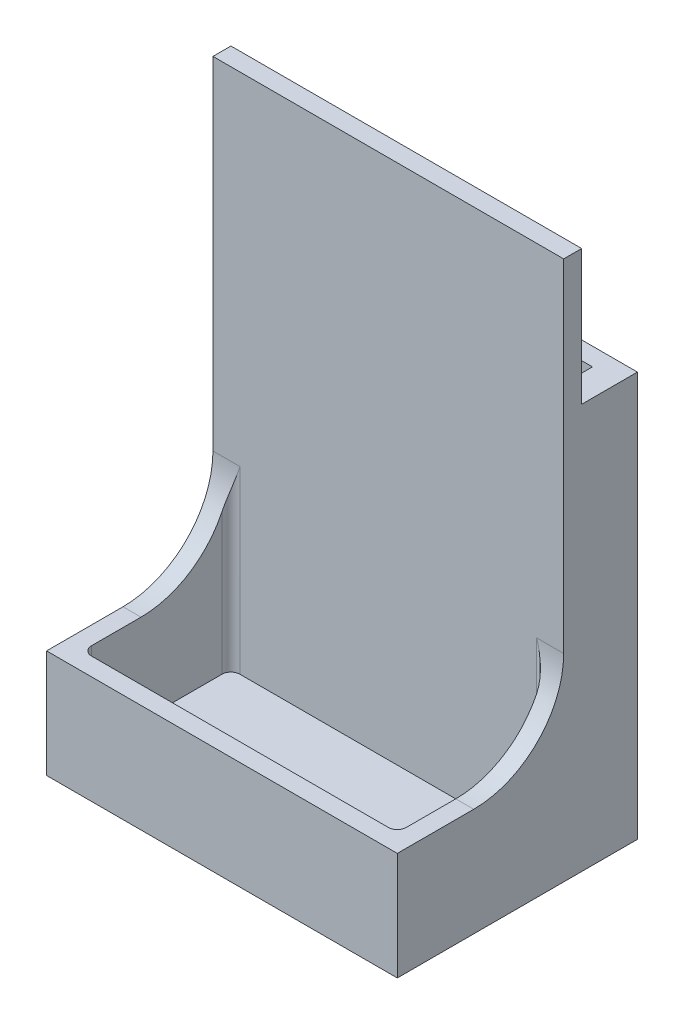
ISO-10303-21;
HEADER;
FILE_DESCRIPTION(('STEP AP214'),'2;1');
FILE_NAME('part.step','',(''),(''),'','','');
FILE_SCHEMA(('AUTOMOTIVE_DESIGN { 1 0 10303 214 1 1 1 1 }'));
ENDSEC;
DATA;
#1=APPLICATION_CONTEXT('core data for automotive mechanical design processes');
#2=APPLICATION_PROTOCOL_DEFINITION('international standard','automotive_design',2000,#1);
#3=PRODUCT_CONTEXT('',#1,'mechanical');
#4=PRODUCT('Part','Part','',(#3));
#5=PRODUCT_RELATED_PRODUCT_CATEGORY('part','',(#4));
#6=PRODUCT_DEFINITION_FORMATION('','',#4);
#7=PRODUCT_DEFINITION_CONTEXT('part definition',#1,'design');
#8=PRODUCT_DEFINITION('design','',#6,#7);
#9=PRODUCT_DEFINITION_SHAPE('','',#8);
#10=(LENGTH_UNIT() NAMED_UNIT(*) SI_UNIT(.MILLI.,.METRE.));
#11=(NAMED_UNIT(*) PLANE_ANGLE_UNIT() SI_UNIT($,.RADIAN.));
#12=(NAMED_UNIT(*) SI_UNIT($,.STERADIAN.) SOLID_ANGLE_UNIT());
#13=UNCERTAINTY_MEASURE_WITH_UNIT(LENGTH_MEASURE(1.E-05),#10,'distance_accuracy_value','');
#14=(GEOMETRIC_REPRESENTATION_CONTEXT(3) GLOBAL_UNCERTAINTY_ASSIGNED_CONTEXT((#13)) GLOBAL_UNIT_ASSIGNED_CONTEXT((#10,
#11,#12)) REPRESENTATION_CONTEXT('',''));
#15=CARTESIAN_POINT('',(0.,0.,0.));
#16=DIRECTION('',(0.,0.,1.));
#17=DIRECTION('',(1.,0.,0.));
#18=AXIS2_PLACEMENT_3D('',#15,#16,#17);
#19=CARTESIAN_POINT('',(-19.5,2.,-10.25));
#20=DIRECTION('',(0.,0.,1.));
#21=DIRECTION('',(1.,0.,0.));
#22=AXIS2_PLACEMENT_3D('',#19,#20,#21);
#23=PLANE('',#22);
#24=DIRECTION('',(0.,-1.,0.));
#25=VECTOR('',#24,1.);
#26=CARTESIAN_POINT('',(6.7679491924311,45.,-10.25));
#27=LINE('',#26,#25);
#28=CARTESIAN_POINT('',(6.7679491924311,45.,-10.25));
#29=VERTEX_POINT('',#28);
#30=CARTESIAN_POINT('',(6.7679491924311,0.,-10.25));
#31=VERTEX_POINT('',#30);
#32=EDGE_CURVE('E259',#29,#31,#27,.T.);
#33=ORIENTED_EDGE('',*,*,#32,.T.);
#34=DIRECTION('',(-1.,0.,0.));
#35=VECTOR('',#34,1.);
#36=CARTESIAN_POINT('',(-19.5,0.,-10.25));
#37=LINE('',#36,#35);
#38=CARTESIAN_POINT('',(-6.7679491924311,0.,-10.25));
#39=VERTEX_POINT('',#38);
#40=EDGE_CURVE('E409',#31,#39,#37,.T.);
#41=ORIENTED_EDGE('',*,*,#40,.T.);
#42=DIRECTION('',(0.,-1.,0.));
#43=VECTOR('',#42,1.);
#44=CARTESIAN_POINT('',(-6.7679491924311,45.,-10.25));
#45=LINE('',#44,#43);
#46=CARTESIAN_POINT('',(-6.7679491924311,45.,-10.25));
#47=VERTEX_POINT('',#46);
#48=EDGE_CURVE('E342',#47,#39,#45,.T.);
#49=ORIENTED_EDGE('',*,*,#48,.F.);
#50=DIRECTION('',(-1.,0.,0.));
#51=VECTOR('',#50,1.);
#52=CARTESIAN_POINT('',(-6.7679491924311,45.,-10.25));
#53=LINE('',#52,#51);
#54=CARTESIAN_POINT('',(-19.5,45.,-10.25));
#55=VERTEX_POINT('',#54);
#56=EDGE_CURVE('E300',#47,#55,#53,.T.);
#57=ORIENTED_EDGE('',*,*,#56,.T.);
#58=DIRECTION('',(0.,-1.,0.));
#59=VECTOR('',#58,1.);
#60=CARTESIAN_POINT('',(-19.5,2.,-10.25));
#61=LINE('',#60,#59);
#62=CARTESIAN_POINT('',(-19.5,60.,-10.25));
#63=VERTEX_POINT('',#62);
#64=EDGE_CURVE('E411',#63,#55,#61,.T.);
#65=ORIENTED_EDGE('',*,*,#64,.F.);
#66=DIRECTION('',(1.,0.,0.));
#67=VECTOR('',#66,1.);
#68=CARTESIAN_POINT('',(-19.5,60.,-10.25));
#69=LINE('',#68,#67);
#70=CARTESIAN_POINT('',(19.5,60.,-10.25));
#71=VERTEX_POINT('',#70);
#72=EDGE_CURVE('E362',#63,#71,#69,.T.);
#73=ORIENTED_EDGE('',*,*,#72,.T.);
#74=DIRECTION('',(0.,-1.,0.));
#75=VECTOR('',#74,1.);
#76=CARTESIAN_POINT('',(19.5,2.,-10.25));
#77=LINE('',#76,#75);
#78=CARTESIAN_POINT('',(19.5,45.,-10.25));
#79=VERTEX_POINT('',#78);
#80=EDGE_CURVE('E63',#71,#79,#77,.T.);
#81=ORIENTED_EDGE('',*,*,#80,.T.);
#82=DIRECTION('',(1.,0.,0.));
#83=VECTOR('',#82,1.);
#84=CARTESIAN_POINT('',(6.7679491924311,45.,-10.25));
#85=LINE('',#84,#83);
#86=EDGE_CURVE('E58',#29,#79,#85,.T.);
#87=ORIENTED_EDGE('',*,*,#86,.F.);
#88=EDGE_LOOP('',(#33,#41,#49,#57,#65,#73,#81,#87));
#89=FACE_BOUND('',#88,.T.);
#90=ADVANCED_FACE('F37',(#89),#23,.F.);
#91=CARTESIAN_POINT('',(-19.5,2.,-10.25));
#92=DIRECTION('',(1.,0.,0.));
#93=DIRECTION('',(0.,0.,-1.));
#94=AXIS2_PLACEMENT_3D('',#91,#92,#93);
#95=PLANE('',#94);
#96=DIRECTION('',(0.,0.,1.));
#97=VECTOR('',#96,1.);
#98=CARTESIAN_POINT('',(-19.5,0.,-10.25));
#99=LINE('',#98,#97);
#100=CARTESIAN_POINT('',(-19.5,0.,-16.45));
#101=VERTEX_POINT('',#100);
#102=CARTESIAN_POINT('',(-19.5,0.,10.25));
#103=VERTEX_POINT('',#102);
#104=EDGE_CURVE('E402',#101,#103,#99,.T.);
#105=ORIENTED_EDGE('',*,*,#104,.T.);
#106=DIRECTION('',(0.,-1.,0.));
#107=VECTOR('',#106,1.);
#108=CARTESIAN_POINT('',(-19.5,2.,10.25));
#109=LINE('',#108,#107);
#110=CARTESIAN_POINT('',(-19.5,12.,10.25));
#111=VERTEX_POINT('',#110);
#112=EDGE_CURVE('E418',#111,#103,#109,.T.);
#113=ORIENTED_EDGE('',*,*,#112,.F.);
#114=DIRECTION('',(0.,0.,1.));
#115=VECTOR('',#114,1.);
#116=CARTESIAN_POINT('',(-19.5,12.,-10.25));
#117=LINE('',#116,#115);
#118=CARTESIAN_POINT('',(-19.5,12.,1.75));
#119=VERTEX_POINT('',#118);
#120=EDGE_CURVE('E384',#119,#111,#117,.T.);
#121=ORIENTED_EDGE('',*,*,#120,.F.);
#122=CARTESIAN_POINT('',(-19.5,22.,1.75));
#123=DIRECTION('',(1.,0.,0.));
#124=DIRECTION('',(0.,0.,-1.));
#125=AXIS2_PLACEMENT_3D('',#122,#123,#124);
#126=CIRCLE('',#125,10.);
#127=CARTESIAN_POINT('',(-19.5,22.,-8.24999999999999));
#128=VERTEX_POINT('',#127);
#129=EDGE_CURVE('E433',#119,#128,#126,.T.);
#130=ORIENTED_EDGE('',*,*,#129,.T.);
#131=DIRECTION('',(0.,-1.,0.));
#132=VECTOR('',#131,1.);
#133=CARTESIAN_POINT('',(-19.5,99.0512483795333,-8.24999999999999));
#134=LINE('',#133,#132);
#135=CARTESIAN_POINT('',(-19.5,60.,-8.24999999999999));
#136=VERTEX_POINT('',#135);
#137=EDGE_CURVE('E371',#136,#128,#134,.T.);
#138=ORIENTED_EDGE('',*,*,#137,.F.);
#139=DIRECTION('',(0.,0.,-1.));
#140=VECTOR('',#139,1.);
#141=CARTESIAN_POINT('',(-19.5,60.,-8.24999999999999));
#142=LINE('',#141,#140);
#143=EDGE_CURVE('E365',#136,#63,#142,.T.);
#144=ORIENTED_EDGE('',*,*,#143,.T.);
#145=ORIENTED_EDGE('',*,*,#64,.T.);
#146=DIRECTION('',(0.,0.,-1.));
#147=VECTOR('',#146,1.);
#148=CARTESIAN_POINT('',(-19.5,45.,-10.25));
#149=LINE('',#148,#147);
#150=CARTESIAN_POINT('',(-19.5,45.,-16.45));
#151=VERTEX_POINT('',#150);
#152=EDGE_CURVE('E303',#55,#151,#149,.T.);
#153=ORIENTED_EDGE('',*,*,#152,.T.);
#154=DIRECTION('',(0.,-1.,0.));
#155=VECTOR('',#154,1.);
#156=CARTESIAN_POINT('',(-19.5,45.,-16.45));
#157=LINE('',#156,#155);
#158=EDGE_CURVE('E325',#151,#101,#157,.T.);
#159=ORIENTED_EDGE('',*,*,#158,.T.);
#160=EDGE_LOOP('',(#105,#113,#121,#130,#138,#144,#145,#153,#159));
#161=FACE_BOUND('',#160,.T.);
#162=ADVANCED_FACE('F498',(#161),#95,.F.);
#163=CARTESIAN_POINT('',(-19.5,2.,10.25));
#164=DIRECTION('',(0.,0.,-1.));
#165=DIRECTION('',(-1.,0.,0.));
#166=AXIS2_PLACEMENT_3D('',#163,#164,#165);
#167=PLANE('',#166);
#168=DIRECTION('',(1.,0.,0.));
#169=VECTOR('',#168,1.);
#170=CARTESIAN_POINT('',(-19.5,0.,10.25));
#171=LINE('',#170,#169);
#172=CARTESIAN_POINT('',(19.5,0.,10.25));
#173=VERTEX_POINT('',#172);
#174=EDGE_CURVE('E405',#103,#173,#171,.T.);
#175=ORIENTED_EDGE('',*,*,#174,.T.);
#176=DIRECTION('',(0.,-1.,0.));
#177=VECTOR('',#176,1.);
#178=CARTESIAN_POINT('',(19.5,2.,10.25));
#179=LINE('',#178,#177);
#180=CARTESIAN_POINT('',(19.5,12.,10.25));
#181=VERTEX_POINT('',#180);
#182=EDGE_CURVE('E415',#181,#173,#179,.T.);
#183=ORIENTED_EDGE('',*,*,#182,.F.);
#184=DIRECTION('',(1.,0.,0.));
#185=VECTOR('',#184,1.);
#186=CARTESIAN_POINT('',(-19.5,12.,10.25));
#187=LINE('',#186,#185);
#188=EDGE_CURVE('E396',#111,#181,#187,.T.);
#189=ORIENTED_EDGE('',*,*,#188,.F.);
#190=ORIENTED_EDGE('',*,*,#112,.T.);
#191=EDGE_LOOP('',(#175,#183,#189,#190));
#192=FACE_BOUND('',#191,.T.);
#193=ADVANCED_FACE('F505',(#192),#167,.F.);
#194=CARTESIAN_POINT('',(19.5,2.,-10.25));
#195=DIRECTION('',(-1.,0.,0.));
#196=DIRECTION('',(0.,0.,1.));
#197=AXIS2_PLACEMENT_3D('',#194,#195,#196);
#198=PLANE('',#197);
#199=DIRECTION('',(0.,0.,-1.));
#200=VECTOR('',#199,1.);
#201=CARTESIAN_POINT('',(19.5,0.,-10.25));
#202=LINE('',#201,#200);
#203=CARTESIAN_POINT('',(19.5,0.,-16.45));
#204=VERTEX_POINT('',#203);
#205=EDGE_CURVE('E407',#173,#204,#202,.T.);
#206=ORIENTED_EDGE('',*,*,#205,.T.);
#207=DIRECTION('',(0.,-1.,0.));
#208=VECTOR('',#207,1.);
#209=CARTESIAN_POINT('',(19.5,45.,-16.45));
#210=LINE('',#209,#208);
#211=CARTESIAN_POINT('',(19.5,45.,-16.45));
#212=VERTEX_POINT('',#211);
#213=EDGE_CURVE('E285',#212,#204,#210,.T.);
#214=ORIENTED_EDGE('',*,*,#213,.F.);
#215=DIRECTION('',(0.,0.,-1.));
#216=VECTOR('',#215,1.);
#217=CARTESIAN_POINT('',(19.5,45.,-10.25));
#218=LINE('',#217,#216);
#219=EDGE_CURVE('E273',#79,#212,#218,.T.);
#220=ORIENTED_EDGE('',*,*,#219,.F.);
#221=ORIENTED_EDGE('',*,*,#80,.F.);
#222=DIRECTION('',(0.,0.,1.));
#223=VECTOR('',#222,1.);
#224=CARTESIAN_POINT('',(19.5,60.,-10.25));
#225=LINE('',#224,#223);
#226=CARTESIAN_POINT('',(19.5,60.,-8.25));
#227=VERTEX_POINT('',#226);
#228=EDGE_CURVE('E358',#71,#227,#225,.T.);
#229=ORIENTED_EDGE('',*,*,#228,.T.);
#230=DIRECTION('',(0.,-1.,0.));
#231=VECTOR('',#230,1.);
#232=CARTESIAN_POINT('',(19.5,99.0512483795333,-8.25));
#233=LINE('',#232,#231);
#234=CARTESIAN_POINT('',(19.5,22.,-8.25));
#235=VERTEX_POINT('',#234);
#236=EDGE_CURVE('E345',#227,#235,#233,.T.);
#237=ORIENTED_EDGE('',*,*,#236,.T.);
#238=CARTESIAN_POINT('',(19.5,22.,1.75));
#239=DIRECTION('',(-1.,0.,0.));
#240=DIRECTION('',(0.,0.,1.));
#241=AXIS2_PLACEMENT_3D('',#238,#239,#240);
#242=CIRCLE('',#241,10.);
#243=CARTESIAN_POINT('',(19.5,12.,1.75));
#244=VERTEX_POINT('',#243);
#245=EDGE_CURVE('E435',#235,#244,#242,.T.);
#246=ORIENTED_EDGE('',*,*,#245,.T.);
#247=DIRECTION('',(0.,0.,-1.));
#248=VECTOR('',#247,1.);
#249=CARTESIAN_POINT('',(19.5,12.,10.25));
#250=LINE('',#249,#248);
#251=EDGE_CURVE('E399',#181,#244,#250,.T.);
#252=ORIENTED_EDGE('',*,*,#251,.F.);
#253=ORIENTED_EDGE('',*,*,#182,.T.);
#254=EDGE_LOOP('',(#206,#214,#220,#221,#229,#237,#246,#252,#253));
#255=FACE_BOUND('',#254,.T.);
#256=ADVANCED_FACE('F511',(#255),#198,.F.);
#257=CARTESIAN_POINT('',(0.,0.,0.));
#258=DIRECTION('',(0.,1.,0.));
#259=DIRECTION('',(0.,0.,1.));
#260=AXIS2_PLACEMENT_3D('',#257,#258,#259);
#261=PLANE('',#260);
#262=ORIENTED_EDGE('',*,*,#104,.F.);
#263=DIRECTION('',(1.,0.,0.));
#264=VECTOR('',#263,1.);
#265=CARTESIAN_POINT('',(-19.5,0.,-16.45));
#266=LINE('',#265,#264);
#267=CARTESIAN_POINT('',(-11.5,0.,-16.45));
#268=VERTEX_POINT('',#267);
#269=EDGE_CURVE('E288',#101,#268,#266,.T.);
#270=ORIENTED_EDGE('',*,*,#269,.T.);
#271=DIRECTION('',(0.,0.,1.));
#272=VECTOR('',#271,1.);
#273=CARTESIAN_POINT('',(-11.5,0.,-16.45));
#274=LINE('',#273,#272);
#275=CARTESIAN_POINT('',(-11.5,0.,-14.45));
#276=VERTEX_POINT('',#275);
#277=EDGE_CURVE('E328',#268,#276,#274,.T.);
#278=ORIENTED_EDGE('',*,*,#277,.T.);
#279=DIRECTION('',(-1.,0.,0.));
#280=VECTOR('',#279,1.);
#281=CARTESIAN_POINT('',(-11.5,0.,-14.45));
#282=LINE('',#281,#280);
#283=CARTESIAN_POINT('',(-16.5,0.,-14.45));
#284=VERTEX_POINT('',#283);
#285=EDGE_CURVE('E331',#276,#284,#282,.T.);
#286=ORIENTED_EDGE('',*,*,#285,.T.);
#287=DIRECTION('',(0.,0.,1.));
#288=VECTOR('',#287,1.);
#289=CARTESIAN_POINT('',(-16.5,0.,-14.45));
#290=LINE('',#289,#288);
#291=CARTESIAN_POINT('',(-16.5,0.,-11.25));
#292=VERTEX_POINT('',#291);
#293=EDGE_CURVE('E334',#284,#292,#290,.T.);
#294=ORIENTED_EDGE('',*,*,#293,.T.);
#295=DIRECTION('',(1.,0.,0.));
#296=VECTOR('',#295,1.);
#297=CARTESIAN_POINT('',(-16.5,0.,-11.25));
#298=LINE('',#297,#296);
#299=CARTESIAN_POINT('',(-8.5,0.,-11.25));
#300=VERTEX_POINT('',#299);
#301=EDGE_CURVE('E337',#292,#300,#298,.T.);
#302=ORIENTED_EDGE('',*,*,#301,.T.);
#303=DIRECTION('',(0.866025403784442,0.,0.499999999999995));
#304=VECTOR('',#303,1.);
#305=CARTESIAN_POINT('',(-8.5,0.,-11.25));
#306=LINE('',#305,#304);
#307=EDGE_CURVE('E304',#300,#39,#306,.T.);
#308=ORIENTED_EDGE('',*,*,#307,.T.);
#309=ORIENTED_EDGE('',*,*,#40,.F.);
#310=DIRECTION('',(-0.866025403784442,0.,0.499999999999995));
#311=VECTOR('',#310,1.);
#312=CARTESIAN_POINT('',(8.5,0.,-11.25));
#313=LINE('',#312,#311);
#314=CARTESIAN_POINT('',(8.5,0.,-11.25));
#315=VERTEX_POINT('',#314);
#316=EDGE_CURVE('E275',#315,#31,#313,.T.);
#317=ORIENTED_EDGE('',*,*,#316,.F.);
#318=DIRECTION('',(-1.,0.,0.));
#319=VECTOR('',#318,1.);
#320=CARTESIAN_POINT('',(16.5,0.,-11.25));
#321=LINE('',#320,#319);
#322=CARTESIAN_POINT('',(16.5,0.,-11.25));
#323=VERTEX_POINT('',#322);
#324=EDGE_CURVE('E254',#323,#315,#321,.T.);
#325=ORIENTED_EDGE('',*,*,#324,.F.);
#326=DIRECTION('',(0.,0.,1.));
#327=VECTOR('',#326,1.);
#328=CARTESIAN_POINT('',(16.5,0.,-14.45));
#329=LINE('',#328,#327);
#330=CARTESIAN_POINT('',(16.5,0.,-14.45));
#331=VERTEX_POINT('',#330);
#332=EDGE_CURVE('E278',#331,#323,#329,.T.);
#333=ORIENTED_EDGE('',*,*,#332,.F.);
#334=DIRECTION('',(1.,0.,0.));
#335=VECTOR('',#334,1.);
#336=CARTESIAN_POINT('',(11.5,0.,-14.45));
#337=LINE('',#336,#335);
#338=CARTESIAN_POINT('',(11.5,0.,-14.45));
#339=VERTEX_POINT('',#338);
#340=EDGE_CURVE('E280',#339,#331,#337,.T.);
#341=ORIENTED_EDGE('',*,*,#340,.F.);
#342=DIRECTION('',(0.,0.,1.));
#343=VECTOR('',#342,1.);
#344=CARTESIAN_POINT('',(11.5,0.,-16.45));
#345=LINE('',#344,#343);
#346=CARTESIAN_POINT('',(11.5,0.,-16.45));
#347=VERTEX_POINT('',#346);
#348=EDGE_CURVE('E282',#347,#339,#345,.T.);
#349=ORIENTED_EDGE('',*,*,#348,.F.);
#350=DIRECTION('',(-1.,0.,0.));
#351=VECTOR('',#350,1.);
#352=CARTESIAN_POINT('',(19.5,0.,-16.45));
#353=LINE('',#352,#351);
#354=EDGE_CURVE('E263',#204,#347,#353,.T.);
#355=ORIENTED_EDGE('',*,*,#354,.F.);
#356=ORIENTED_EDGE('',*,*,#205,.F.);
#357=ORIENTED_EDGE('',*,*,#174,.F.);
#358=EDGE_LOOP('',(#262,#270,#278,#286,#294,#302,#308,#309,#317,#325,#333,#341,#349,#355,#356,#357));
#359=FACE_BOUND('',#358,.T.);
#360=ADVANCED_FACE('F509',(#359),#261,.F.);
#361=CARTESIAN_POINT('',(0.,12.,0.));
#362=DIRECTION('',(0.,1.,0.));
#363=DIRECTION('',(0.,0.,1.));
#364=AXIS2_PLACEMENT_3D('',#361,#362,#363);
#365=PLANE('',#364);
#366=DIRECTION('',(0.,0.,1.));
#367=VECTOR('',#366,1.);
#368=CARTESIAN_POINT('',(-17.5,12.,-8.25));
#369=LINE('',#368,#367);
#370=CARTESIAN_POINT('',(-17.5,12.,1.75));
#371=VERTEX_POINT('',#370);
#372=CARTESIAN_POINT('',(-17.5,12.,7.25));
#373=VERTEX_POINT('',#372);
#374=EDGE_CURVE('E375',#371,#373,#369,.T.);
#375=ORIENTED_EDGE('',*,*,#374,.F.);
#376=DIRECTION('',(1.,0.,0.));
#377=VECTOR('',#376,1.);
#378=CARTESIAN_POINT('',(-19.5,12.,1.75));
#379=LINE('',#378,#377);
#380=EDGE_CURVE('E429',#371,#119,#379,.F.);
#381=ORIENTED_EDGE('',*,*,#380,.T.);
#382=ORIENTED_EDGE('',*,*,#120,.T.);
#383=ORIENTED_EDGE('',*,*,#188,.T.);
#384=ORIENTED_EDGE('',*,*,#251,.T.);
#385=DIRECTION('',(1.,0.,0.));
#386=VECTOR('',#385,1.);
#387=CARTESIAN_POINT('',(17.5,12.,1.75));
#388=LINE('',#387,#386);
#389=CARTESIAN_POINT('',(17.5,12.,1.75));
#390=VERTEX_POINT('',#389);
#391=EDGE_CURVE('E426',#244,#390,#388,.F.);
#392=ORIENTED_EDGE('',*,*,#391,.T.);
#393=DIRECTION('',(0.,0.,-1.));
#394=VECTOR('',#393,1.);
#395=CARTESIAN_POINT('',(17.5,12.,8.25));
#396=LINE('',#395,#394);
#397=CARTESIAN_POINT('',(17.5,12.,7.25));
#398=VERTEX_POINT('',#397);
#399=EDGE_CURVE('E382',#398,#390,#396,.T.);
#400=ORIENTED_EDGE('',*,*,#399,.F.);
#401=CARTESIAN_POINT('',(16.5,12.,7.25));
#402=DIRECTION('',(0.,1.,0.));
#403=DIRECTION('',(0.,0.,1.));
#404=AXIS2_PLACEMENT_3D('',#401,#402,#403);
#405=CIRCLE('',#404,1.);
#406=CARTESIAN_POINT('',(16.5,12.,8.25));
#407=VERTEX_POINT('',#406);
#408=EDGE_CURVE('E51',#398,#407,#405,.F.);
#409=ORIENTED_EDGE('',*,*,#408,.T.);
#410=DIRECTION('',(1.,0.,0.));
#411=VECTOR('',#410,1.);
#412=CARTESIAN_POINT('',(-17.5,12.,8.25));
#413=LINE('',#412,#411);
#414=CARTESIAN_POINT('',(-16.5,12.,8.25));
#415=VERTEX_POINT('',#414);
#416=EDGE_CURVE('E378',#415,#407,#413,.T.);
#417=ORIENTED_EDGE('',*,*,#416,.F.);
#418=CARTESIAN_POINT('',(-16.5,12.,7.25));
#419=DIRECTION('',(0.,1.,0.));
#420=DIRECTION('',(0.,0.,1.));
#421=AXIS2_PLACEMENT_3D('',#418,#419,#420);
#422=CIRCLE('',#421,1.);
#423=EDGE_CURVE('E469',#415,#373,#422,.F.);
#424=ORIENTED_EDGE('',*,*,#423,.T.);
#425=EDGE_LOOP('',(#375,#381,#382,#383,#384,#392,#400,#409,#417,#424));
#426=FACE_BOUND('',#425,.T.);
#427=ADVANCED_FACE('F555',(#426),#365,.T.);
#428=CARTESIAN_POINT('',(-17.5,12.,-8.25));
#429=DIRECTION('',(1.,0.,0.));
#430=DIRECTION('',(0.,0.,-1.));
#431=AXIS2_PLACEMENT_3D('',#428,#429,#430);
#432=PLANE('',#431);
#433=ORIENTED_EDGE('',*,*,#374,.T.);
#434=DIRECTION('',(0.,-1.,0.));
#435=VECTOR('',#434,1.);
#436=CARTESIAN_POINT('',(-17.5,2.,7.25));
#437=LINE('',#436,#435);
#438=CARTESIAN_POINT('',(-17.5,2.,7.25));
#439=VERTEX_POINT('',#438);
#440=EDGE_CURVE('E442',#373,#439,#437,.T.);
#441=ORIENTED_EDGE('',*,*,#440,.T.);
#442=DIRECTION('',(0.,0.,1.));
#443=VECTOR('',#442,1.);
#444=CARTESIAN_POINT('',(-17.5,2.,-8.25));
#445=LINE('',#444,#443);
#446=CARTESIAN_POINT('',(-17.5,2.,-7.25));
#447=VERTEX_POINT('',#446);
#448=EDGE_CURVE('E368',#447,#439,#445,.T.);
#449=ORIENTED_EDGE('',*,*,#448,.F.);
#450=DIRECTION('',(0.,-1.,0.));
#451=VECTOR('',#450,1.);
#452=CARTESIAN_POINT('',(-17.5,22.,-7.25));
#453=LINE('',#452,#451);
#454=CARTESIAN_POINT('',(-17.5,17.6411010564593,-7.25));
#455=VERTEX_POINT('',#454);
#456=EDGE_CURVE('E440',#447,#455,#453,.F.);
#457=ORIENTED_EDGE('',*,*,#456,.T.);
#458=CARTESIAN_POINT('',(-17.5,22.,1.75));
#459=DIRECTION('',(1.,0.,0.));
#460=DIRECTION('',(0.,0.,-1.));
#461=AXIS2_PLACEMENT_3D('',#458,#459,#460);
#462=CIRCLE('',#461,10.);
#463=EDGE_CURVE('E431',#455,#371,#462,.F.);
#464=ORIENTED_EDGE('',*,*,#463,.T.);
#465=EDGE_LOOP('',(#433,#441,#449,#457,#464));
#466=FACE_BOUND('',#465,.T.);
#467=ADVANCED_FACE('F573',(#466),#432,.T.);
#468=CARTESIAN_POINT('',(-17.5,12.,8.25));
#469=DIRECTION('',(0.,0.,-1.));
#470=DIRECTION('',(-1.,0.,0.));
#471=AXIS2_PLACEMENT_3D('',#468,#469,#470);
#472=PLANE('',#471);
#473=DIRECTION('',(1.,0.,0.));
#474=VECTOR('',#473,1.);
#475=CARTESIAN_POINT('',(-17.5,2.,8.25));
#476=LINE('',#475,#474);
#477=CARTESIAN_POINT('',(-16.5,2.,8.25));
#478=VERTEX_POINT('',#477);
#479=CARTESIAN_POINT('',(16.5,2.,8.25));
#480=VERTEX_POINT('',#479);
#481=EDGE_CURVE('E387',#478,#480,#476,.T.);
#482=ORIENTED_EDGE('',*,*,#481,.F.);
#483=DIRECTION('',(0.,-1.,0.));
#484=VECTOR('',#483,1.);
#485=CARTESIAN_POINT('',(-16.5,12.,8.25));
#486=LINE('',#485,#484);
#487=EDGE_CURVE('E456',#478,#415,#486,.F.);
#488=ORIENTED_EDGE('',*,*,#487,.T.);
#489=ORIENTED_EDGE('',*,*,#416,.T.);
#490=DIRECTION('',(0.,-1.,0.));
#491=VECTOR('',#490,1.);
#492=CARTESIAN_POINT('',(16.5,2.,8.25));
#493=LINE('',#492,#491);
#494=EDGE_CURVE('E453',#407,#480,#493,.T.);
#495=ORIENTED_EDGE('',*,*,#494,.T.);
#496=EDGE_LOOP('',(#482,#488,#489,#495));
#497=FACE_BOUND('',#496,.T.);
#498=ADVANCED_FACE('F581',(#497),#472,.T.);
#499=CARTESIAN_POINT('',(17.5,12.,8.25));
#500=DIRECTION('',(-1.,0.,0.));
#501=DIRECTION('',(0.,0.,1.));
#502=AXIS2_PLACEMENT_3D('',#499,#500,#501);
#503=PLANE('',#502);
#504=DIRECTION('',(0.,0.,-1.));
#505=VECTOR('',#504,1.);
#506=CARTESIAN_POINT('',(17.5,2.,8.25));
#507=LINE('',#506,#505);
#508=CARTESIAN_POINT('',(17.5,2.,7.25));
#509=VERTEX_POINT('',#508);
#510=CARTESIAN_POINT('',(17.5,2.,-7.25));
#511=VERTEX_POINT('',#510);
#512=EDGE_CURVE('E390',#509,#511,#507,.T.);
#513=ORIENTED_EDGE('',*,*,#512,.F.);
#514=DIRECTION('',(0.,-1.,0.));
#515=VECTOR('',#514,1.);
#516=CARTESIAN_POINT('',(17.5,12.,7.25));
#517=LINE('',#516,#515);
#518=EDGE_CURVE('E467',#509,#398,#517,.F.);
#519=ORIENTED_EDGE('',*,*,#518,.T.);
#520=ORIENTED_EDGE('',*,*,#399,.T.);
#521=CARTESIAN_POINT('',(17.5,22.,1.75));
#522=DIRECTION('',(-1.,0.,0.));
#523=DIRECTION('',(0.,0.,1.));
#524=AXIS2_PLACEMENT_3D('',#521,#522,#523);
#525=CIRCLE('',#524,10.);
#526=CARTESIAN_POINT('',(17.5,17.6411010564593,-7.25));
#527=VERTEX_POINT('',#526);
#528=EDGE_CURVE('E437',#390,#527,#525,.F.);
#529=ORIENTED_EDGE('',*,*,#528,.T.);
#530=DIRECTION('',(0.,-1.,0.));
#531=VECTOR('',#530,1.);
#532=CARTESIAN_POINT('',(17.5,2.,-7.25));
#533=LINE('',#532,#531);
#534=EDGE_CURVE('E464',#527,#511,#533,.T.);
#535=ORIENTED_EDGE('',*,*,#534,.T.);
#536=EDGE_LOOP('',(#513,#519,#520,#529,#535));
#537=FACE_BOUND('',#536,.T.);
#538=ADVANCED_FACE('F563',(#537),#503,.T.);
#539=CARTESIAN_POINT('',(17.5,12.,-8.25));
#540=DIRECTION('',(0.,0.,1.));
#541=DIRECTION('',(1.,0.,0.));
#542=AXIS2_PLACEMENT_3D('',#539,#540,#541);
#543=PLANE('',#542);
#544=DIRECTION('',(1.,0.,0.));
#545=VECTOR('',#544,1.);
#546=CARTESIAN_POINT('',(-17.5,22.,-8.25));
#547=LINE('',#546,#545);
#548=CARTESIAN_POINT('',(-16.5,22.,-8.25));
#549=VERTEX_POINT('',#548);
#550=EDGE_CURVE('E424',#128,#549,#547,.T.);
#551=ORIENTED_EDGE('',*,*,#550,.T.);
#552=DIRECTION('',(0.,-1.,0.));
#553=VECTOR('',#552,1.);
#554=CARTESIAN_POINT('',(-16.5,2.,-8.25));
#555=LINE('',#554,#553);
#556=CARTESIAN_POINT('',(-16.5,2.,-8.25));
#557=VERTEX_POINT('',#556);
#558=EDGE_CURVE('E461',#549,#557,#555,.T.);
#559=ORIENTED_EDGE('',*,*,#558,.T.);
#560=DIRECTION('',(-1.,0.,0.));
#561=VECTOR('',#560,1.);
#562=CARTESIAN_POINT('',(17.5,2.,-8.25));
#563=LINE('',#562,#561);
#564=CARTESIAN_POINT('',(16.5,2.,-8.25));
#565=VERTEX_POINT('',#564);
#566=EDGE_CURVE('E379',#565,#557,#563,.T.);
#567=ORIENTED_EDGE('',*,*,#566,.F.);
#568=DIRECTION('',(0.,-1.,0.));
#569=VECTOR('',#568,1.);
#570=CARTESIAN_POINT('',(16.5,22.,-8.25));
#571=LINE('',#570,#569);
#572=CARTESIAN_POINT('',(16.5,22.,-8.25));
#573=VERTEX_POINT('',#572);
#574=EDGE_CURVE('E458',#565,#573,#571,.F.);
#575=ORIENTED_EDGE('',*,*,#574,.T.);
#576=DIRECTION('',(1.,0.,0.));
#577=VECTOR('',#576,1.);
#578=CARTESIAN_POINT('',(19.5,22.,-8.25));
#579=LINE('',#578,#577);
#580=EDGE_CURVE('E421',#573,#235,#579,.T.);
#581=ORIENTED_EDGE('',*,*,#580,.T.);
#582=ORIENTED_EDGE('',*,*,#236,.F.);
#583=DIRECTION('',(-1.,0.,0.));
#584=VECTOR('',#583,1.);
#585=CARTESIAN_POINT('',(19.5,60.,-8.25));
#586=LINE('',#585,#584);
#587=EDGE_CURVE('E361',#227,#136,#586,.T.);
#588=ORIENTED_EDGE('',*,*,#587,.T.);
#589=ORIENTED_EDGE('',*,*,#137,.T.);
#590=EDGE_LOOP('',(#551,#559,#567,#575,#581,#582,#588,#589));
#591=FACE_BOUND('',#590,.T.);
#592=ADVANCED_FACE('F550',(#591),#543,.T.);
#593=CARTESIAN_POINT('',(0.,2.,0.));
#594=DIRECTION('',(0.,1.,0.));
#595=DIRECTION('',(0.,0.,1.));
#596=AXIS2_PLACEMENT_3D('',#593,#594,#595);
#597=PLANE('',#596);
#598=ORIENTED_EDGE('',*,*,#448,.T.);
#599=CARTESIAN_POINT('',(-16.5,2.,7.25));
#600=DIRECTION('',(0.,1.,0.));
#601=DIRECTION('',(0.,0.,1.));
#602=AXIS2_PLACEMENT_3D('',#599,#600,#601);
#603=CIRCLE('',#602,1.);
#604=EDGE_CURVE('E451',#439,#478,#603,.T.);
#605=ORIENTED_EDGE('',*,*,#604,.T.);
#606=ORIENTED_EDGE('',*,*,#481,.T.);
#607=CARTESIAN_POINT('',(16.5,2.,7.25));
#608=DIRECTION('',(0.,1.,0.));
#609=DIRECTION('',(0.,0.,1.));
#610=AXIS2_PLACEMENT_3D('',#607,#608,#609);
#611=CIRCLE('',#610,1.);
#612=EDGE_CURVE('E447',#480,#509,#611,.T.);
#613=ORIENTED_EDGE('',*,*,#612,.T.);
#614=ORIENTED_EDGE('',*,*,#512,.T.);
#615=CARTESIAN_POINT('',(16.5,2.,-7.25));
#616=DIRECTION('',(0.,1.,0.));
#617=DIRECTION('',(0.,0.,1.));
#618=AXIS2_PLACEMENT_3D('',#615,#616,#617);
#619=CIRCLE('',#618,1.);
#620=EDGE_CURVE('E445',#511,#565,#619,.T.);
#621=ORIENTED_EDGE('',*,*,#620,.T.);
#622=ORIENTED_EDGE('',*,*,#566,.T.);
#623=CARTESIAN_POINT('',(-16.5,2.,-7.25));
#624=DIRECTION('',(0.,1.,0.));
#625=DIRECTION('',(0.,0.,1.));
#626=AXIS2_PLACEMENT_3D('',#623,#624,#625);
#627=CIRCLE('',#626,1.);
#628=EDGE_CURVE('E449',#557,#447,#627,.T.);
#629=ORIENTED_EDGE('',*,*,#628,.T.);
#630=EDGE_LOOP('',(#598,#605,#606,#613,#614,#621,#622,#629));
#631=FACE_BOUND('',#630,.T.);
#632=ADVANCED_FACE('F567',(#631),#597,.T.);
#633=CARTESIAN_POINT('',(0.,60.,0.));
#634=DIRECTION('',(0.,-1.,0.));
#635=DIRECTION('',(0.,0.,-1.));
#636=AXIS2_PLACEMENT_3D('',#633,#634,#635);
#637=PLANE('',#636);
#638=ORIENTED_EDGE('',*,*,#587,.F.);
#639=ORIENTED_EDGE('',*,*,#228,.F.);
#640=ORIENTED_EDGE('',*,*,#72,.F.);
#641=ORIENTED_EDGE('',*,*,#143,.F.);
#642=EDGE_LOOP('',(#638,#639,#640,#641));
#643=FACE_BOUND('',#642,.T.);
#644=ADVANCED_FACE('F542',(#643),#637,.F.);
#645=CARTESIAN_POINT('',(17.5,22.,1.75));
#646=DIRECTION('',(-1.,0.,0.));
#647=DIRECTION('',(0.,0.,1.));
#648=AXIS2_PLACEMENT_3D('',#645,#646,#647);
#649=CYLINDRICAL_SURFACE('',#648,10.);
#650=ORIENTED_EDGE('',*,*,#129,.F.);
#651=ORIENTED_EDGE('',*,*,#380,.F.);
#652=ORIENTED_EDGE('',*,*,#463,.F.);
#653=CARTESIAN_POINT('',(-17.5,17.6411010564593,-7.25));
#654=CARTESIAN_POINT('',(-17.4999848209211,17.7134235352193,-7.28502940811183));
#655=CARTESIAN_POINT('',(-17.4981602500917,17.7861516441531,-7.3191750261579));
#656=CARTESIAN_POINT('',(-17.4913249959408,17.9322557522661,-7.3856381823875));
#657=CARTESIAN_POINT('',(-17.4863156759162,18.0056314609801,-7.4179564963429));
#658=CARTESIAN_POINT('',(-17.4735553006808,18.1527858398386,-7.48067336525738));
#659=CARTESIAN_POINT('',(-17.4658096126191,18.2265634447684,-7.51107554197181));
#660=CARTESIAN_POINT('',(-17.4479134181199,18.3745758310975,-7.57001323089682));
#661=CARTESIAN_POINT('',(-17.4377626184677,18.4488106671638,-7.59854851496692));
#662=CARTESIAN_POINT('',(-17.4042508026629,18.6714574381416,-7.68110737250044));
#663=CARTESIAN_POINT('',(-17.3777703035533,18.8204432772423,-7.73235268862305));
#664=CARTESIAN_POINT('',(-17.3183470101449,19.1195366016167,-7.82745203655496));
#665=CARTESIAN_POINT('',(-17.2854000817914,19.2696447450272,-7.87130130647467));
#666=CARTESIAN_POINT('',(-17.2001222740548,19.6317440465196,-7.96798906645472));
#667=CARTESIAN_POINT('',(-17.1453512953646,19.8441250764139,-8.017253054055));
#668=CARTESIAN_POINT('',(-17.02912713526,20.2697930286866,-8.10157380993527));
#669=CARTESIAN_POINT('',(-16.9676729532072,20.4830800821123,-8.13662844700476));
#670=CARTESIAN_POINT('',(-16.776997032134,21.1239804956501,-8.22086857638156));
#671=CARTESIAN_POINT('',(-16.6414271121449,21.5527670936441,-8.24916563253541));
#672=CARTESIAN_POINT('',(-16.5040200887541,21.9872873004373,-8.24999393532311));
#673=CARTESIAN_POINT('',(-16.5020100111763,21.9936437224489,-8.24999999552881));
#674=CARTESIAN_POINT('',(-16.5,22.,-8.25));
#675=B_SPLINE_CURVE_WITH_KNOTS('',3,(#653,#654,#655,#656,#657,#658,#659,#660,#661,#662,#663,
#664,#665,#666,#667,#668,#669,#670,#671,#672,#673,#674),.UNSPECIFIED.,.F.,.F.,(4,2,2,2,2,2,2,2,
2,2,4),(0.,0.241022397911275,0.481941690674439,0.722391040963687,0.962869720289912,
1.44176483881832,1.92096712310372,2.59465687968435,3.26844764326597,4.61560355969885,
4.63560356796335),.UNSPECIFIED.);
#676=EDGE_CURVE('E471',#455,#549,#675,.T.);
#677=ORIENTED_EDGE('',*,*,#676,.T.);
#678=ORIENTED_EDGE('',*,*,#550,.F.);
#679=EDGE_LOOP('',(#650,#651,#652,#677,#678));
#680=FACE_BOUND('',#679,.T.);
#681=ADVANCED_FACE('F479',(#680),#649,.F.);
#682=CARTESIAN_POINT('',(17.5,22.,1.75));
#683=DIRECTION('',(-1.,0.,0.));
#684=DIRECTION('',(0.,0.,1.));
#685=AXIS2_PLACEMENT_3D('',#682,#683,#684);
#686=CYLINDRICAL_SURFACE('',#685,10.);
#687=ORIENTED_EDGE('',*,*,#528,.F.);
#688=ORIENTED_EDGE('',*,*,#391,.F.);
#689=ORIENTED_EDGE('',*,*,#245,.F.);
#690=ORIENTED_EDGE('',*,*,#580,.F.);
#691=CARTESIAN_POINT('',(17.5,17.6411010564593,-7.25));
#692=CARTESIAN_POINT('',(17.4999848209211,17.7134235352193,-7.28502940811182));
#693=CARTESIAN_POINT('',(17.4981602500917,17.786151644153,-7.31917502615788));
#694=CARTESIAN_POINT('',(17.4913249959408,17.932255752266,-7.38563818238746));
#695=CARTESIAN_POINT('',(17.4863156759162,18.00563146098,-7.41795649634286));
#696=CARTESIAN_POINT('',(17.4735553006808,18.1527858398384,-7.48067336525732));
#697=CARTESIAN_POINT('',(17.4658096126191,18.2265634447682,-7.51107554197174));
#698=CARTESIAN_POINT('',(17.4479134181199,18.3745758310973,-7.57001323089674));
#699=CARTESIAN_POINT('',(17.4377626184677,18.4488106671635,-7.59854851496683));
#700=CARTESIAN_POINT('',(17.4042508026629,18.6714574381414,-7.68110737250037));
#701=CARTESIAN_POINT('',(17.3777703035533,18.8204432772421,-7.732352688623));
#702=CARTESIAN_POINT('',(17.3183470101449,19.1195366016166,-7.82745203655493));
#703=CARTESIAN_POINT('',(17.2854000817914,19.2696447450271,-7.87130130647466));
#704=CARTESIAN_POINT('',(17.2001222740548,19.6317440465196,-7.96798906645472));
#705=CARTESIAN_POINT('',(17.1453512953647,19.8441250764139,-8.017253054055));
#706=CARTESIAN_POINT('',(17.02912713526,20.2697930286866,-8.10157380993527));
#707=CARTESIAN_POINT('',(16.967672953207,20.4830800821123,-8.13662844700477));
#708=CARTESIAN_POINT('',(16.7769970321345,21.1239804956503,-8.22086857638156));
#709=CARTESIAN_POINT('',(16.6414271121478,21.552767093645,-8.24916563253541));
#710=CARTESIAN_POINT('',(16.5040200887541,21.9872873004373,-8.24999393532311));
#711=CARTESIAN_POINT('',(16.5020100111763,21.993643722449,-8.24999999552881));
#712=CARTESIAN_POINT('',(16.5,22.,-8.25));
#713=B_SPLINE_CURVE_WITH_KNOTS('',3,(#691,#692,#693,#694,#695,#696,#697,#698,#699,#700,#701,
#702,#703,#704,#705,#706,#707,#708,#709,#710,#711,#712),.UNSPECIFIED.,.F.,.F.,(4,2,2,2,2,2,2,2,
2,2,4),(0.,0.241022397911206,0.481941690674299,0.722391040963483,0.962869720289654,
1.4417648388182,1.92096712310372,2.59465687968436,3.26844764326603,4.61560355969885,
4.63560356796335),.UNSPECIFIED.);
#714=EDGE_CURVE('E11',#573,#527,#713,.F.);
#715=ORIENTED_EDGE('',*,*,#714,.T.);
#716=EDGE_LOOP('',(#687,#688,#689,#690,#715));
#717=FACE_BOUND('',#716,.T.);
#718=ADVANCED_FACE('F558',(#717),#686,.F.);
#719=CARTESIAN_POINT('',(-16.5,12.,7.25));
#720=DIRECTION('',(0.,1.,0.));
#721=DIRECTION('',(0.,0.,1.));
#722=AXIS2_PLACEMENT_3D('',#719,#720,#721);
#723=CYLINDRICAL_SURFACE('',#722,1.);
#724=ORIENTED_EDGE('',*,*,#423,.F.);
#725=ORIENTED_EDGE('',*,*,#487,.F.);
#726=ORIENTED_EDGE('',*,*,#604,.F.);
#727=ORIENTED_EDGE('',*,*,#440,.F.);
#728=EDGE_LOOP('',(#724,#725,#726,#727));
#729=FACE_BOUND('',#728,.T.);
#730=ADVANCED_FACE('F487',(#729),#723,.F.);
#731=CARTESIAN_POINT('',(-16.5,12.,-7.25));
#732=DIRECTION('',(0.,1.,0.));
#733=DIRECTION('',(0.,0.,1.));
#734=AXIS2_PLACEMENT_3D('',#731,#732,#733);
#735=CYLINDRICAL_SURFACE('',#734,1.);
#736=ORIENTED_EDGE('',*,*,#676,.F.);
#737=ORIENTED_EDGE('',*,*,#456,.F.);
#738=ORIENTED_EDGE('',*,*,#628,.F.);
#739=ORIENTED_EDGE('',*,*,#558,.F.);
#740=EDGE_LOOP('',(#736,#737,#738,#739));
#741=FACE_BOUND('',#740,.T.);
#742=ADVANCED_FACE('F482',(#741),#735,.F.);
#743=CARTESIAN_POINT('',(16.5,12.,7.25));
#744=DIRECTION('',(0.,1.,0.));
#745=DIRECTION('',(0.,0.,1.));
#746=AXIS2_PLACEMENT_3D('',#743,#744,#745);
#747=CYLINDRICAL_SURFACE('',#746,1.);
#748=ORIENTED_EDGE('',*,*,#408,.F.);
#749=ORIENTED_EDGE('',*,*,#518,.F.);
#750=ORIENTED_EDGE('',*,*,#612,.F.);
#751=ORIENTED_EDGE('',*,*,#494,.F.);
#752=EDGE_LOOP('',(#748,#749,#750,#751));
#753=FACE_BOUND('',#752,.T.);
#754=ADVANCED_FACE('F486',(#753),#747,.F.);
#755=CARTESIAN_POINT('',(16.5,12.,-7.25));
#756=DIRECTION('',(0.,1.,0.));
#757=DIRECTION('',(0.,0.,1.));
#758=AXIS2_PLACEMENT_3D('',#755,#756,#757);
#759=CYLINDRICAL_SURFACE('',#758,1.);
#760=ORIENTED_EDGE('',*,*,#714,.F.);
#761=ORIENTED_EDGE('',*,*,#574,.F.);
#762=ORIENTED_EDGE('',*,*,#620,.F.);
#763=ORIENTED_EDGE('',*,*,#534,.F.);
#764=EDGE_LOOP('',(#760,#761,#762,#763));
#765=FACE_BOUND('',#764,.T.);
#766=ADVANCED_FACE('F39',(#765),#759,.F.);
#767=CARTESIAN_POINT('',(-8.5,45.,-11.25));
#768=DIRECTION('',(0.499999999999995,0.,-0.866025403784442));
#769=DIRECTION('',(-0.866025403784442,0.,-0.499999999999995));
#770=AXIS2_PLACEMENT_3D('',#767,#768,#769);
#771=PLANE('',#770);
#772=ORIENTED_EDGE('',*,*,#307,.F.);
#773=DIRECTION('',(0.,-1.,0.));
#774=VECTOR('',#773,1.);
#775=CARTESIAN_POINT('',(-8.5,45.,-11.25));
#776=LINE('',#775,#774);
#777=CARTESIAN_POINT('',(-8.5,45.,-11.25));
#778=VERTEX_POINT('',#777);
#779=EDGE_CURVE('E346',#778,#300,#776,.T.);
#780=ORIENTED_EDGE('',*,*,#779,.F.);
#781=DIRECTION('',(0.866025403784442,0.,0.499999999999995));
#782=VECTOR('',#781,1.);
#783=CARTESIAN_POINT('',(-8.5,45.,-11.25));
#784=LINE('',#783,#782);
#785=EDGE_CURVE('E322',#778,#47,#784,.T.);
#786=ORIENTED_EDGE('',*,*,#785,.T.);
#787=ORIENTED_EDGE('',*,*,#48,.T.);
#788=EDGE_LOOP('',(#772,#780,#786,#787));
#789=FACE_BOUND('',#788,.T.);
#790=ADVANCED_FACE('F494',(#789),#771,.T.);
#791=CARTESIAN_POINT('',(-16.5,45.,-11.25));
#792=DIRECTION('',(0.,0.,-1.));
#793=DIRECTION('',(-1.,0.,0.));
#794=AXIS2_PLACEMENT_3D('',#791,#792,#793);
#795=PLANE('',#794);
#796=ORIENTED_EDGE('',*,*,#301,.F.);
#797=DIRECTION('',(0.,-1.,0.));
#798=VECTOR('',#797,1.);
#799=CARTESIAN_POINT('',(-16.5,45.,-11.25));
#800=LINE('',#799,#798);
#801=CARTESIAN_POINT('',(-16.5,45.,-11.25));
#802=VERTEX_POINT('',#801);
#803=EDGE_CURVE('E348',#802,#292,#800,.T.);
#804=ORIENTED_EDGE('',*,*,#803,.F.);
#805=DIRECTION('',(1.,0.,0.));
#806=VECTOR('',#805,1.);
#807=CARTESIAN_POINT('',(-16.5,45.,-11.25));
#808=LINE('',#807,#806);
#809=EDGE_CURVE('E319',#802,#778,#808,.T.);
#810=ORIENTED_EDGE('',*,*,#809,.T.);
#811=ORIENTED_EDGE('',*,*,#779,.T.);
#812=EDGE_LOOP('',(#796,#804,#810,#811));
#813=FACE_BOUND('',#812,.T.);
#814=ADVANCED_FACE('F621',(#813),#795,.T.);
#815=CARTESIAN_POINT('',(-16.5,45.,-14.45));
#816=DIRECTION('',(1.,0.,0.));
#817=DIRECTION('',(0.,0.,-1.));
#818=AXIS2_PLACEMENT_3D('',#815,#816,#817);
#819=PLANE('',#818);
#820=ORIENTED_EDGE('',*,*,#293,.F.);
#821=DIRECTION('',(0.,-1.,0.));
#822=VECTOR('',#821,1.);
#823=CARTESIAN_POINT('',(-16.5,45.,-14.45));
#824=LINE('',#823,#822);
#825=CARTESIAN_POINT('',(-16.5,45.,-14.45));
#826=VERTEX_POINT('',#825);
#827=EDGE_CURVE('E350',#826,#284,#824,.T.);
#828=ORIENTED_EDGE('',*,*,#827,.F.);
#829=DIRECTION('',(0.,0.,1.));
#830=VECTOR('',#829,1.);
#831=CARTESIAN_POINT('',(-16.5,45.,-14.45));
#832=LINE('',#831,#830);
#833=EDGE_CURVE('E316',#826,#802,#832,.T.);
#834=ORIENTED_EDGE('',*,*,#833,.T.);
#835=ORIENTED_EDGE('',*,*,#803,.T.);
#836=EDGE_LOOP('',(#820,#828,#834,#835));
#837=FACE_BOUND('',#836,.T.);
#838=ADVANCED_FACE('F630',(#837),#819,.T.);
#839=CARTESIAN_POINT('',(-11.5,45.,-14.45));
#840=DIRECTION('',(0.,0.,1.));
#841=DIRECTION('',(1.,0.,0.));
#842=AXIS2_PLACEMENT_3D('',#839,#840,#841);
#843=PLANE('',#842);
#844=ORIENTED_EDGE('',*,*,#285,.F.);
#845=DIRECTION('',(0.,-1.,0.));
#846=VECTOR('',#845,1.);
#847=CARTESIAN_POINT('',(-11.5,45.,-14.45));
#848=LINE('',#847,#846);
#849=CARTESIAN_POINT('',(-11.5,45.,-14.45));
#850=VERTEX_POINT('',#849);
#851=EDGE_CURVE('E352',#850,#276,#848,.T.);
#852=ORIENTED_EDGE('',*,*,#851,.F.);
#853=DIRECTION('',(-1.,0.,0.));
#854=VECTOR('',#853,1.);
#855=CARTESIAN_POINT('',(-11.5,45.,-14.45));
#856=LINE('',#855,#854);
#857=EDGE_CURVE('E313',#850,#826,#856,.T.);
#858=ORIENTED_EDGE('',*,*,#857,.T.);
#859=ORIENTED_EDGE('',*,*,#827,.T.);
#860=EDGE_LOOP('',(#844,#852,#858,#859));
#861=FACE_BOUND('',#860,.T.);
#862=ADVANCED_FACE('F638',(#861),#843,.T.);
#863=CARTESIAN_POINT('',(-11.5,45.,-16.45));
#864=DIRECTION('',(1.,0.,0.));
#865=DIRECTION('',(0.,0.,-1.));
#866=AXIS2_PLACEMENT_3D('',#863,#864,#865);
#867=PLANE('',#866);
#868=ORIENTED_EDGE('',*,*,#277,.F.);
#869=DIRECTION('',(0.,-1.,0.));
#870=VECTOR('',#869,1.);
#871=CARTESIAN_POINT('',(-11.5,45.,-16.45));
#872=LINE('',#871,#870);
#873=CARTESIAN_POINT('',(-11.5,45.,-16.45));
#874=VERTEX_POINT('',#873);
#875=EDGE_CURVE('E354',#874,#268,#872,.T.);
#876=ORIENTED_EDGE('',*,*,#875,.F.);
#877=DIRECTION('',(0.,0.,1.));
#878=VECTOR('',#877,1.);
#879=CARTESIAN_POINT('',(-11.5,45.,-16.45));
#880=LINE('',#879,#878);
#881=EDGE_CURVE('E310',#874,#850,#880,.T.);
#882=ORIENTED_EDGE('',*,*,#881,.T.);
#883=ORIENTED_EDGE('',*,*,#851,.T.);
#884=EDGE_LOOP('',(#868,#876,#882,#883));
#885=FACE_BOUND('',#884,.T.);
#886=ADVANCED_FACE('F646',(#885),#867,.T.);
#887=CARTESIAN_POINT('',(-19.5,45.,-16.45));
#888=DIRECTION('',(0.,0.,-1.));
#889=DIRECTION('',(-1.,0.,0.));
#890=AXIS2_PLACEMENT_3D('',#887,#888,#889);
#891=PLANE('',#890);
#892=ORIENTED_EDGE('',*,*,#269,.F.);
#893=ORIENTED_EDGE('',*,*,#158,.F.);
#894=DIRECTION('',(1.,0.,0.));
#895=VECTOR('',#894,1.);
#896=CARTESIAN_POINT('',(-19.5,45.,-16.45));
#897=LINE('',#896,#895);
#898=EDGE_CURVE('E307',#151,#874,#897,.T.);
#899=ORIENTED_EDGE('',*,*,#898,.T.);
#900=ORIENTED_EDGE('',*,*,#875,.T.);
#901=EDGE_LOOP('',(#892,#893,#899,#900));
#902=FACE_BOUND('',#901,.T.);
#903=ADVANCED_FACE('F598',(#902),#891,.T.);
#904=CARTESIAN_POINT('',(0.,45.,0.));
#905=DIRECTION('',(0.,-1.,0.));
#906=DIRECTION('',(0.,0.,-1.));
#907=AXIS2_PLACEMENT_3D('',#904,#905,#906);
#908=PLANE('',#907);
#909=ORIENTED_EDGE('',*,*,#56,.F.);
#910=ORIENTED_EDGE('',*,*,#785,.F.);
#911=ORIENTED_EDGE('',*,*,#809,.F.);
#912=ORIENTED_EDGE('',*,*,#833,.F.);
#913=ORIENTED_EDGE('',*,*,#857,.F.);
#914=ORIENTED_EDGE('',*,*,#881,.F.);
#915=ORIENTED_EDGE('',*,*,#898,.F.);
#916=ORIENTED_EDGE('',*,*,#152,.F.);
#917=EDGE_LOOP('',(#909,#910,#911,#912,#913,#914,#915,#916));
#918=FACE_BOUND('',#917,.T.);
#919=ADVANCED_FACE('F660',(#918),#908,.F.);
#920=CARTESIAN_POINT('',(19.5,45.,-16.45));
#921=DIRECTION('',(0.,0.,1.));
#922=DIRECTION('',(1.,0.,0.));
#923=AXIS2_PLACEMENT_3D('',#920,#921,#922);
#924=PLANE('',#923);
#925=ORIENTED_EDGE('',*,*,#354,.T.);
#926=DIRECTION('',(0.,-1.,0.));
#927=VECTOR('',#926,1.);
#928=CARTESIAN_POINT('',(11.5,45.,-16.45));
#929=LINE('',#928,#927);
#930=CARTESIAN_POINT('',(11.5,45.,-16.45));
#931=VERTEX_POINT('',#930);
#932=EDGE_CURVE('E289',#931,#347,#929,.T.);
#933=ORIENTED_EDGE('',*,*,#932,.F.);
#934=DIRECTION('',(-1.,0.,0.));
#935=VECTOR('',#934,1.);
#936=CARTESIAN_POINT('',(19.5,45.,-16.45));
#937=LINE('',#936,#935);
#938=EDGE_CURVE('E271',#212,#931,#937,.T.);
#939=ORIENTED_EDGE('',*,*,#938,.F.);
#940=ORIENTED_EDGE('',*,*,#213,.T.);
#941=EDGE_LOOP('',(#925,#933,#939,#940));
#942=FACE_BOUND('',#941,.T.);
#943=ADVANCED_FACE('F531',(#942),#924,.F.);
#944=CARTESIAN_POINT('',(11.5,45.,-16.45));
#945=DIRECTION('',(1.,0.,0.));
#946=DIRECTION('',(0.,0.,-1.));
#947=AXIS2_PLACEMENT_3D('',#944,#945,#946);
#948=PLANE('',#947);
#949=ORIENTED_EDGE('',*,*,#348,.T.);
#950=DIRECTION('',(0.,-1.,0.));
#951=VECTOR('',#950,1.);
#952=CARTESIAN_POINT('',(11.5,45.,-14.45));
#953=LINE('',#952,#951);
#954=CARTESIAN_POINT('',(11.5,45.,-14.45));
#955=VERTEX_POINT('',#954);
#956=EDGE_CURVE('E292',#955,#339,#953,.T.);
#957=ORIENTED_EDGE('',*,*,#956,.F.);
#958=DIRECTION('',(0.,0.,1.));
#959=VECTOR('',#958,1.);
#960=CARTESIAN_POINT('',(11.5,45.,-16.45));
#961=LINE('',#960,#959);
#962=EDGE_CURVE('E269',#931,#955,#961,.T.);
#963=ORIENTED_EDGE('',*,*,#962,.F.);
#964=ORIENTED_EDGE('',*,*,#932,.T.);
#965=EDGE_LOOP('',(#949,#957,#963,#964));
#966=FACE_BOUND('',#965,.T.);
#967=ADVANCED_FACE('F535',(#966),#948,.F.);
#968=CARTESIAN_POINT('',(11.5,45.,-14.45));
#969=DIRECTION('',(0.,0.,-1.));
#970=DIRECTION('',(-1.,0.,0.));
#971=AXIS2_PLACEMENT_3D('',#968,#969,#970);
#972=PLANE('',#971);
#973=ORIENTED_EDGE('',*,*,#340,.T.);
#974=DIRECTION('',(0.,-1.,0.));
#975=VECTOR('',#974,1.);
#976=CARTESIAN_POINT('',(16.5,45.,-14.45));
#977=LINE('',#976,#975);
#978=CARTESIAN_POINT('',(16.5,45.,-14.45));
#979=VERTEX_POINT('',#978);
#980=EDGE_CURVE('E295',#979,#331,#977,.T.);
#981=ORIENTED_EDGE('',*,*,#980,.F.);
#982=DIRECTION('',(1.,0.,0.));
#983=VECTOR('',#982,1.);
#984=CARTESIAN_POINT('',(11.5,45.,-14.45));
#985=LINE('',#984,#983);
#986=EDGE_CURVE('E267',#955,#979,#985,.T.);
#987=ORIENTED_EDGE('',*,*,#986,.F.);
#988=ORIENTED_EDGE('',*,*,#956,.T.);
#989=EDGE_LOOP('',(#973,#981,#987,#988));
#990=FACE_BOUND('',#989,.T.);
#991=ADVANCED_FACE('F678',(#990),#972,.F.);
#992=CARTESIAN_POINT('',(16.5,45.,-14.45));
#993=DIRECTION('',(1.,0.,0.));
#994=DIRECTION('',(0.,0.,-1.));
#995=AXIS2_PLACEMENT_3D('',#992,#993,#994);
#996=PLANE('',#995);
#997=ORIENTED_EDGE('',*,*,#332,.T.);
#998=DIRECTION('',(0.,-1.,0.));
#999=VECTOR('',#998,1.);
#1000=CARTESIAN_POINT('',(16.5,45.,-11.25));
#1001=LINE('',#1000,#999);
#1002=CARTESIAN_POINT('',(16.5,45.,-11.25));
#1003=VERTEX_POINT('',#1002);
#1004=EDGE_CURVE('E258',#1003,#323,#1001,.T.);
#1005=ORIENTED_EDGE('',*,*,#1004,.F.);
#1006=DIRECTION('',(0.,0.,1.));
#1007=VECTOR('',#1006,1.);
#1008=CARTESIAN_POINT('',(16.5,45.,-14.45));
#1009=LINE('',#1008,#1007);
#1010=EDGE_CURVE('E245',#979,#1003,#1009,.T.);
#1011=ORIENTED_EDGE('',*,*,#1010,.F.);
#1012=ORIENTED_EDGE('',*,*,#980,.T.);
#1013=EDGE_LOOP('',(#997,#1005,#1011,#1012));
#1014=FACE_BOUND('',#1013,.T.);
#1015=ADVANCED_FACE('F685',(#1014),#996,.F.);
#1016=CARTESIAN_POINT('',(16.5,45.,-11.25));
#1017=DIRECTION('',(0.,0.,1.));
#1018=DIRECTION('',(1.,0.,0.));
#1019=AXIS2_PLACEMENT_3D('',#1016,#1017,#1018);
#1020=PLANE('',#1019);
#1021=ORIENTED_EDGE('',*,*,#324,.T.);
#1022=DIRECTION('',(0.,-1.,0.));
#1023=VECTOR('',#1022,1.);
#1024=CARTESIAN_POINT('',(8.5,45.,-11.25));
#1025=LINE('',#1024,#1023);
#1026=CARTESIAN_POINT('',(8.5,45.,-11.25));
#1027=VERTEX_POINT('',#1026);
#1028=EDGE_CURVE('E251',#1027,#315,#1025,.T.);
#1029=ORIENTED_EDGE('',*,*,#1028,.F.);
#1030=DIRECTION('',(-1.,0.,0.));
#1031=VECTOR('',#1030,1.);
#1032=CARTESIAN_POINT('',(16.5,45.,-11.25));
#1033=LINE('',#1032,#1031);
#1034=EDGE_CURVE('E238',#1003,#1027,#1033,.T.);
#1035=ORIENTED_EDGE('',*,*,#1034,.F.);
#1036=ORIENTED_EDGE('',*,*,#1004,.T.);
#1037=EDGE_LOOP('',(#1021,#1029,#1035,#1036));
#1038=FACE_BOUND('',#1037,.T.);
#1039=ADVANCED_FACE('F252',(#1038),#1020,.F.);
#1040=CARTESIAN_POINT('',(8.5,45.,-11.25));
#1041=DIRECTION('',(0.499999999999995,0.,0.866025403784442));
#1042=DIRECTION('',(0.866025403784442,0.,-0.499999999999995));
#1043=AXIS2_PLACEMENT_3D('',#1040,#1041,#1042);
#1044=PLANE('',#1043);
#1045=ORIENTED_EDGE('',*,*,#316,.T.);
#1046=ORIENTED_EDGE('',*,*,#32,.F.);
#1047=DIRECTION('',(-0.866025403784442,0.,0.499999999999995));
#1048=VECTOR('',#1047,1.);
#1049=CARTESIAN_POINT('',(8.5,45.,-11.25));
#1050=LINE('',#1049,#1048);
#1051=EDGE_CURVE('E242',#1027,#29,#1050,.T.);
#1052=ORIENTED_EDGE('',*,*,#1051,.F.);
#1053=ORIENTED_EDGE('',*,*,#1028,.T.);
#1054=EDGE_LOOP('',(#1045,#1046,#1052,#1053));
#1055=FACE_BOUND('',#1054,.T.);
#1056=ADVANCED_FACE('F261',(#1055),#1044,.F.);
#1057=CARTESIAN_POINT('',(0.,45.,0.));
#1058=DIRECTION('',(0.,-1.,0.));
#1059=DIRECTION('',(0.,0.,-1.));
#1060=AXIS2_PLACEMENT_3D('',#1057,#1058,#1059);
#1061=PLANE('',#1060);
#1062=ORIENTED_EDGE('',*,*,#86,.T.);
#1063=ORIENTED_EDGE('',*,*,#219,.T.);
#1064=ORIENTED_EDGE('',*,*,#938,.T.);
#1065=ORIENTED_EDGE('',*,*,#962,.T.);
#1066=ORIENTED_EDGE('',*,*,#986,.T.);
#1067=ORIENTED_EDGE('',*,*,#1010,.T.);
#1068=ORIENTED_EDGE('',*,*,#1034,.T.);
#1069=ORIENTED_EDGE('',*,*,#1051,.T.);
#1070=EDGE_LOOP('',(#1062,#1063,#1064,#1065,#1066,#1067,#1068,#1069));
#1071=FACE_BOUND('',#1070,.T.);
#1072=ADVANCED_FACE('F240',(#1071),#1061,.F.);
#1073=CLOSED_SHELL('',(#90,#162,#193,#256,#360,#427,#467,#498,#538,#592,#632,#644,#681,#718,
#730,#742,#754,#766,#790,#814,#838,#862,#886,#903,#919,#943,#967,#991,#1015,#1039,#1056,#1072));
#1074=MANIFOLD_SOLID_BREP('B2',#1073);
#1075=ADVANCED_BREP_SHAPE_REPRESENTATION('',(#18,#1074),#14);
#1076=SHAPE_DEFINITION_REPRESENTATION(#9,#1075);
ENDSEC;
END-ISO-10303-21;
